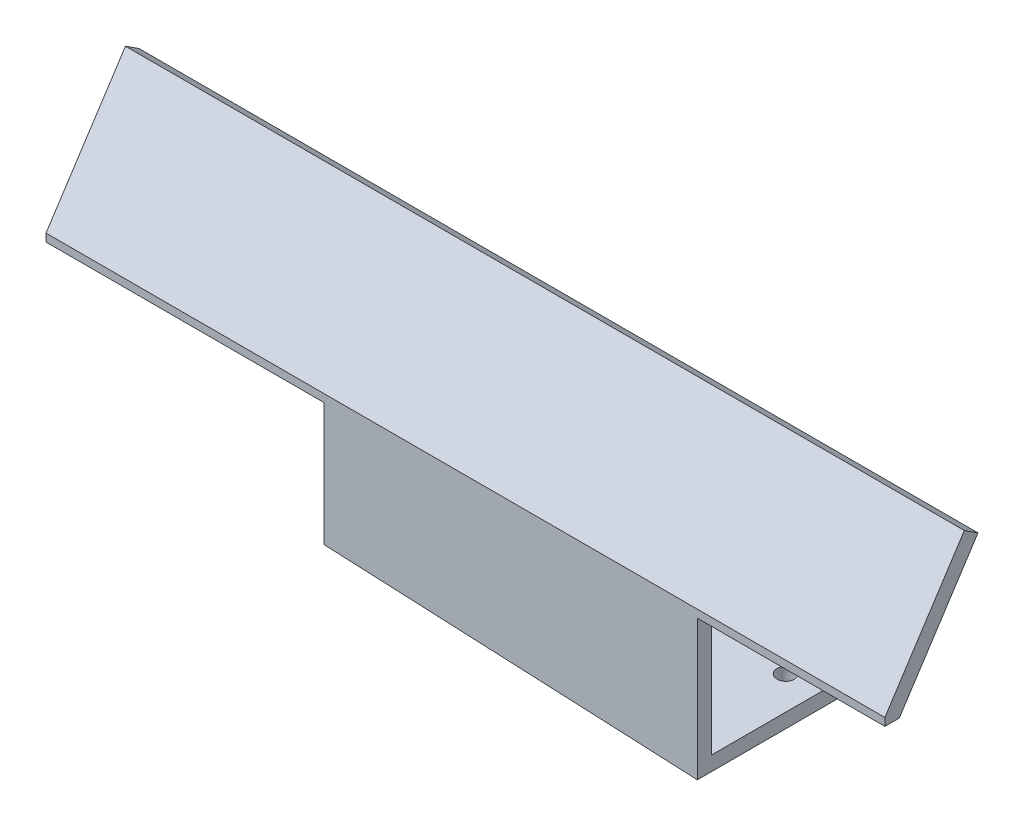
ISO-10303-21;
HEADER;
FILE_DESCRIPTION(('STEP AP214'),'2;1');
FILE_NAME('part.step','',(''),(''),'','','');
FILE_SCHEMA(('AUTOMOTIVE_DESIGN { 1 0 10303 214 1 1 1 1 }'));
ENDSEC;
DATA;
#1=APPLICATION_CONTEXT('core data for automotive mechanical design processes');
#2=APPLICATION_PROTOCOL_DEFINITION('international standard','automotive_design',2000,#1);
#3=PRODUCT_CONTEXT('',#1,'mechanical');
#4=PRODUCT('Part','Part','',(#3));
#5=PRODUCT_RELATED_PRODUCT_CATEGORY('part','',(#4));
#6=PRODUCT_DEFINITION_FORMATION('','',#4);
#7=PRODUCT_DEFINITION_CONTEXT('part definition',#1,'design');
#8=PRODUCT_DEFINITION('design','',#6,#7);
#9=PRODUCT_DEFINITION_SHAPE('','',#8);
#10=(LENGTH_UNIT() NAMED_UNIT(*) SI_UNIT(.MILLI.,.METRE.));
#11=(NAMED_UNIT(*) PLANE_ANGLE_UNIT() SI_UNIT($,.RADIAN.));
#12=(NAMED_UNIT(*) SI_UNIT($,.STERADIAN.) SOLID_ANGLE_UNIT());
#13=UNCERTAINTY_MEASURE_WITH_UNIT(LENGTH_MEASURE(1.E-05),#10,'distance_accuracy_value','');
#14=(GEOMETRIC_REPRESENTATION_CONTEXT(3) GLOBAL_UNCERTAINTY_ASSIGNED_CONTEXT((#13)) GLOBAL_UNIT_ASSIGNED_CONTEXT((#10,
#11,#12)) REPRESENTATION_CONTEXT('',''));
#15=CARTESIAN_POINT('',(0.,0.,0.));
#16=DIRECTION('',(0.,0.,1.));
#17=DIRECTION('',(1.,0.,0.));
#18=AXIS2_PLACEMENT_3D('',#15,#16,#17);
#19=CARTESIAN_POINT('',(0.,-27.8330856524257,8.58819121069135));
#20=DIRECTION('',(-0.0456665936873856,-0.99895673691156,0.));
#21=DIRECTION('',(0.99895673691156,-0.0456665936873856,0.));
#22=AXIS2_PLACEMENT_3D('',#19,#20,#21);
#23=PLANE('',#22);
#24=DIRECTION('',(0.,0.,-1.));
#25=VECTOR('',#24,1.);
#26=CARTESIAN_POINT('',(135.876250770617,-34.0445714019396,8.58819121069135));
#27=LINE('',#26,#25);
#28=CARTESIAN_POINT('',(135.876250770617,-34.0445714019396,8.58819121069136));
#29=VERTEX_POINT('',#28);
#30=CARTESIAN_POINT('',(135.876250770617,-34.0445714019396,-21.4118087893087));
#31=VERTEX_POINT('',#30);
#32=EDGE_CURVE('E172',#29,#31,#27,.T.);
#33=ORIENTED_EDGE('',*,*,#32,.F.);
#34=DIRECTION('',(-0.99895673691156,0.0456665936873856,0.));
#35=VECTOR('',#34,1.);
#36=CARTESIAN_POINT('',(0.,-27.8330856524257,8.58819121069135));
#37=LINE('',#36,#35);
#38=CARTESIAN_POINT('',(57.9999999999998,-30.4845142238542,8.58819121069136));
#39=VERTEX_POINT('',#38);
#40=EDGE_CURVE('E159',#29,#39,#37,.T.);
#41=ORIENTED_EDGE('',*,*,#40,.T.);
#42=DIRECTION('',(0.,0.,1.));
#43=VECTOR('',#42,1.);
#44=CARTESIAN_POINT('',(57.9999999999998,-30.4845142238542,8.58819121069135));
#45=LINE('',#44,#43);
#46=CARTESIAN_POINT('',(57.9999999999998,-30.4845142238542,-21.4118087893087));
#47=VERTEX_POINT('',#46);
#48=EDGE_CURVE('E210',#47,#39,#45,.T.);
#49=ORIENTED_EDGE('',*,*,#48,.F.);
#50=DIRECTION('',(0.99895673691156,-0.0456665936873856,0.));
#51=VECTOR('',#50,1.);
#52=CARTESIAN_POINT('',(0.,-27.8330856524257,-21.4118087893087));
#53=LINE('',#52,#51);
#54=EDGE_CURVE('E220',#47,#31,#53,.T.);
#55=ORIENTED_EDGE('',*,*,#54,.T.);
#56=EDGE_LOOP('',(#33,#41,#49,#55));
#57=FACE_BOUND('',#56,.T.);
#58=CARTESIAN_POINT('',(129.113000218938,-33.7353942338628,-16.4118087893087));
#59=DIRECTION('',(-0.0456665936873856,-0.99895673691156,0.));
#60=DIRECTION('',(0.99895673691156,-0.0456665936873856,0.));
#61=AXIS2_PLACEMENT_3D('',#58,#59,#60);
#62=CIRCLE('',#61,1.8);
#63=CARTESIAN_POINT('',(130.911122345379,-33.8175941025001,-16.4118087893087));
#64=VERTEX_POINT('',#63);
#65=EDGE_CURVE('E180',#64,#64,#62,.F.);
#66=ORIENTED_EDGE('',*,*,#65,.T.);
#67=EDGE_LOOP('',(#66));
#68=FACE_BOUND('',#67,.T.);
#69=CARTESIAN_POINT('',(81.6130002189377,-31.5639656624343,-16.4118087893087));
#70=DIRECTION('',(-0.0456665936873856,-0.99895673691156,0.));
#71=DIRECTION('',(0.99895673691156,-0.0456665936873856,0.));
#72=AXIS2_PLACEMENT_3D('',#69,#70,#71);
#73=CIRCLE('',#72,1.79999999999999);
#74=CARTESIAN_POINT('',(83.4111223453785,-31.6461655310715,-16.4118087893087));
#75=VERTEX_POINT('',#74);
#76=EDGE_CURVE('E187',#75,#75,#73,.T.);
#77=ORIENTED_EDGE('',*,*,#76,.F.);
#78=EDGE_LOOP('',(#77));
#79=FACE_BOUND('',#78,.T.);
#80=ADVANCED_FACE('F42',(#57,#68,#79),#23,.T.);
#81=CARTESIAN_POINT('',(-1.13271640106812,-24.778171273365,0.));
#82=DIRECTION('',(-0.0456665936873856,-0.99895673691156,0.));
#83=DIRECTION('',(0.99895673691156,-0.0456665936873856,0.));
#84=AXIS2_PLACEMENT_3D('',#81,#82,#83);
#85=PLANE('',#84);
#86=DIRECTION('',(0.99895673691156,-0.0456665936873856,0.));
#87=VECTOR('',#86,1.);
#88=CARTESIAN_POINT('',(174.492701335583,-32.8067617984691,5.58819121069135));
#89=LINE('',#88,#87);
#90=CARTESIAN_POINT('',(57.9999999999998,-27.4813811659853,5.58819121069135));
#91=VERTEX_POINT('',#90);
#92=CARTESIAN_POINT('',(135.876250770617,-31.0414383440707,5.58819121069135));
#93=VERTEX_POINT('',#92);
#94=EDGE_CURVE('E225',#91,#93,#89,.T.);
#95=ORIENTED_EDGE('',*,*,#94,.T.);
#96=DIRECTION('',(0.,0.,-1.));
#97=VECTOR('',#96,1.);
#98=CARTESIAN_POINT('',(135.876250770617,-31.0414383440706,0.));
#99=LINE('',#98,#97);
#100=CARTESIAN_POINT('',(135.876250770617,-31.0414383440707,-21.4118087893087));
#101=VERTEX_POINT('',#100);
#102=EDGE_CURVE('E168',#93,#101,#99,.T.);
#103=ORIENTED_EDGE('',*,*,#102,.T.);
#104=DIRECTION('',(0.99895673691156,-0.0456665936873856,0.));
#105=VECTOR('',#104,1.);
#106=CARTESIAN_POINT('',(0.136999781062157,-24.836215441691,-21.4118087893087));
#107=LINE('',#106,#105);
#108=CARTESIAN_POINT('',(57.9999999999998,-27.4813811659853,-21.4118087893087));
#109=VERTEX_POINT('',#108);
#110=EDGE_CURVE('E221',#109,#101,#107,.T.);
#111=ORIENTED_EDGE('',*,*,#110,.F.);
#112=DIRECTION('',(0.,0.,1.));
#113=VECTOR('',#112,1.);
#114=CARTESIAN_POINT('',(57.9999999999998,-27.4813811659853,0.));
#115=LINE('',#114,#113);
#116=EDGE_CURVE('E57',#109,#91,#115,.T.);
#117=ORIENTED_EDGE('',*,*,#116,.T.);
#118=EDGE_LOOP('',(#95,#103,#111,#117));
#119=FACE_BOUND('',#118,.T.);
#120=CARTESIAN_POINT('',(129.25,-30.7385240231282,-16.4118087893087));
#121=DIRECTION('',(-0.0456665936873856,-0.99895673691156,0.));
#122=DIRECTION('',(0.99895673691156,-0.0456665936873856,0.));
#123=AXIS2_PLACEMENT_3D('',#120,#121,#122);
#124=CIRCLE('',#123,1.8);
#125=CARTESIAN_POINT('',(131.048122126441,-30.8207238917655,-16.4118087893087));
#126=VERTEX_POINT('',#125);
#127=EDGE_CURVE('E175',#126,#126,#124,.T.);
#128=ORIENTED_EDGE('',*,*,#127,.T.);
#129=EDGE_LOOP('',(#128));
#130=FACE_BOUND('',#129,.T.);
#131=CARTESIAN_POINT('',(81.7499999999999,-28.5670954516996,-16.4118087893087));
#132=DIRECTION('',(0.0456665936873856,0.99895673691156,0.));
#133=DIRECTION('',(-0.99895673691156,0.0456665936873856,0.));
#134=AXIS2_PLACEMENT_3D('',#131,#132,#133);
#135=CIRCLE('',#134,1.79999999999999);
#136=CARTESIAN_POINT('',(79.9518778735591,-28.4848955830623,-16.4118087893087));
#137=VERTEX_POINT('',#136);
#138=EDGE_CURVE('E176',#137,#137,#135,.T.);
#139=ORIENTED_EDGE('',*,*,#138,.F.);
#140=EDGE_LOOP('',(#139));
#141=FACE_BOUND('',#140,.T.);
#142=ADVANCED_FACE('F280',(#119,#130,#141),#85,.F.);
#143=CARTESIAN_POINT('',(175.,-21.7096035143508,5.58819121069135));
#144=DIRECTION('',(0.,0.,1.));
#145=DIRECTION('',(0.,-1.,0.));
#146=AXIS2_PLACEMENT_3D('',#143,#144,#145);
#147=PLANE('',#146);
#148=DIRECTION('',(-1.,0.,0.));
#149=VECTOR('',#148,1.);
#150=CARTESIAN_POINT('',(175.,-4.83308565242567,5.58819121069135));
#151=LINE('',#150,#149);
#152=CARTESIAN_POINT('',(135.876250770617,-4.83308565242567,5.58819121069135));
#153=VERTEX_POINT('',#152);
#154=CARTESIAN_POINT('',(57.9999999999998,-4.83308565242567,5.58819121069135));
#155=VERTEX_POINT('',#154);
#156=EDGE_CURVE('E265',#153,#155,#151,.T.);
#157=ORIENTED_EDGE('',*,*,#156,.F.);
#158=DIRECTION('',(0.,-1.,0.));
#159=VECTOR('',#158,1.);
#160=CARTESIAN_POINT('',(135.876250770617,-21.7096035143508,5.58819121069135));
#161=LINE('',#160,#159);
#162=EDGE_CURVE('E153',#153,#93,#161,.T.);
#163=ORIENTED_EDGE('',*,*,#162,.T.);
#164=ORIENTED_EDGE('',*,*,#94,.F.);
#165=DIRECTION('',(0.,1.,0.));
#166=VECTOR('',#165,1.);
#167=CARTESIAN_POINT('',(57.9999999999998,-21.7096035143508,5.58819121069135));
#168=LINE('',#167,#166);
#169=EDGE_CURVE('E206',#91,#155,#168,.T.);
#170=ORIENTED_EDGE('',*,*,#169,.T.);
#171=EDGE_LOOP('',(#157,#163,#164,#170));
#172=FACE_BOUND('',#171,.T.);
#173=ADVANCED_FACE('F44',(#172),#147,.F.);
#174=CARTESIAN_POINT('',(175.,-21.7096035143508,8.58819121069135));
#175=DIRECTION('',(0.,0.,-1.));
#176=DIRECTION('',(-1.,0.,0.));
#177=AXIS2_PLACEMENT_3D('',#174,#175,#176);
#178=PLANE('',#177);
#179=DIRECTION('',(0.,1.,0.));
#180=VECTOR('',#179,1.);
#181=CARTESIAN_POINT('',(135.876250770617,-4.83308565242567,8.58819121069136));
#182=LINE('',#181,#180);
#183=CARTESIAN_POINT('',(135.876250770617,-4.83308565242567,8.58819121069136));
#184=VERTEX_POINT('',#183);
#185=EDGE_CURVE('E150',#29,#184,#182,.T.);
#186=ORIENTED_EDGE('',*,*,#185,.T.);
#187=DIRECTION('',(1.,0.,0.));
#188=VECTOR('',#187,1.);
#189=CARTESIAN_POINT('',(0.,-4.83308565242567,8.58819121069135));
#190=LINE('',#189,#188);
#191=CARTESIAN_POINT('',(175.,-4.83308565242567,8.58819121069135));
#192=VERTEX_POINT('',#191);
#193=EDGE_CURVE('E135',#184,#192,#190,.T.);
#194=ORIENTED_EDGE('',*,*,#193,.T.);
#195=DIRECTION('',(0.,-1.,0.));
#196=VECTOR('',#195,1.);
#197=CARTESIAN_POINT('',(175.,-21.7096035143508,8.58819121069135));
#198=LINE('',#197,#196);
#199=CARTESIAN_POINT('',(175.,-3.20960351435076,8.58819121069135));
#200=VERTEX_POINT('',#199);
#201=EDGE_CURVE('E243',#200,#192,#198,.T.);
#202=ORIENTED_EDGE('',*,*,#201,.F.);
#203=DIRECTION('',(-1.,0.,0.));
#204=VECTOR('',#203,1.);
#205=CARTESIAN_POINT('',(175.,-3.20960351435076,8.58819121069135));
#206=LINE('',#205,#204);
#207=CARTESIAN_POINT('',(0.,-3.20960351435076,8.58819121069135));
#208=VERTEX_POINT('',#207);
#209=EDGE_CURVE('E246',#200,#208,#206,.T.);
#210=ORIENTED_EDGE('',*,*,#209,.T.);
#211=DIRECTION('',(0.,-1.,0.));
#212=VECTOR('',#211,1.);
#213=CARTESIAN_POINT('',(0.,-21.7096035143508,8.58819121069135));
#214=LINE('',#213,#212);
#215=CARTESIAN_POINT('',(0.,-4.83308565242567,8.58819121069135));
#216=VERTEX_POINT('',#215);
#217=EDGE_CURVE('E238',#208,#216,#214,.T.);
#218=ORIENTED_EDGE('',*,*,#217,.T.);
#219=DIRECTION('',(1.,0.,0.));
#220=VECTOR('',#219,1.);
#221=CARTESIAN_POINT('',(0.,-4.83308565242567,8.58819121069135));
#222=LINE('',#221,#220);
#223=CARTESIAN_POINT('',(57.9999999999998,-4.83308565242567,8.58819121069135));
#224=VERTEX_POINT('',#223);
#225=EDGE_CURVE('E190',#216,#224,#222,.T.);
#226=ORIENTED_EDGE('',*,*,#225,.T.);
#227=DIRECTION('',(0.,-1.,0.));
#228=VECTOR('',#227,1.);
#229=CARTESIAN_POINT('',(57.9999999999998,0.,8.58819121069135));
#230=LINE('',#229,#228);
#231=EDGE_CURVE('E195',#224,#39,#230,.T.);
#232=ORIENTED_EDGE('',*,*,#231,.T.);
#233=ORIENTED_EDGE('',*,*,#40,.F.);
#234=EDGE_LOOP('',(#186,#194,#202,#210,#218,#226,#232,#233));
#235=FACE_BOUND('',#234,.T.);
#236=ADVANCED_FACE('F157',(#235),#178,.F.);
#237=CARTESIAN_POINT('',(0.136999781062157,-24.836215441691,-21.4118087893087));
#238=DIRECTION('',(0.,0.,-1.));
#239=DIRECTION('',(0.,1.,0.));
#240=AXIS2_PLACEMENT_3D('',#237,#238,#239);
#241=PLANE('',#240);
#242=DIRECTION('',(0.,1.,0.));
#243=VECTOR('',#242,1.);
#244=CARTESIAN_POINT('',(135.876250770617,-4.83308565242567,-21.4118087893087));
#245=LINE('',#244,#243);
#246=EDGE_CURVE('E161',#31,#101,#245,.T.);
#247=ORIENTED_EDGE('',*,*,#246,.F.);
#248=ORIENTED_EDGE('',*,*,#54,.F.);
#249=DIRECTION('',(0.,-1.,0.));
#250=VECTOR('',#249,1.);
#251=CARTESIAN_POINT('',(57.9999999999998,-24.836215441691,-21.4118087893087));
#252=LINE('',#251,#250);
#253=EDGE_CURVE('E11',#109,#47,#252,.T.);
#254=ORIENTED_EDGE('',*,*,#253,.F.);
#255=ORIENTED_EDGE('',*,*,#110,.T.);
#256=EDGE_LOOP('',(#247,#248,#254,#255));
#257=FACE_BOUND('',#256,.T.);
#258=ADVANCED_FACE('F285',(#257),#241,.T.);
#259=CARTESIAN_POINT('',(175.,0.,0.));
#260=DIRECTION('',(1.,0.,0.));
#261=DIRECTION('',(0.,0.,-1.));
#262=AXIS2_PLACEMENT_3D('',#259,#260,#261);
#263=PLANE('',#262);
#264=DIRECTION('',(0.,0.,1.));
#265=VECTOR('',#264,1.);
#266=CARTESIAN_POINT('',(175.,-4.83308565242567,0.));
#267=LINE('',#266,#265);
#268=CARTESIAN_POINT('',(175.,-4.83308565242567,5.58819121069135));
#269=VERTEX_POINT('',#268);
#270=EDGE_CURVE('E140',#269,#192,#267,.T.);
#271=ORIENTED_EDGE('',*,*,#270,.F.);
#272=DIRECTION('',(0.,0.83822570686827,-0.545323449289675));
#273=VECTOR('',#272,1.);
#274=CARTESIAN_POINT('',(175.,20.4183582468598,-10.8396090510669));
#275=LINE('',#274,#273);
#276=CARTESIAN_POINT('',(175.,20.4183582468598,-10.8396090510669));
#277=VERTEX_POINT('',#276);
#278=EDGE_CURVE('E88',#269,#277,#275,.T.);
#279=ORIENTED_EDGE('',*,*,#278,.T.);
#280=DIRECTION('',(0.,0.545323449289676,0.83822570686827));
#281=VECTOR('',#280,1.);
#282=CARTESIAN_POINT('',(175.,22.2724579744447,-7.98964164771477));
#283=LINE('',#282,#281);
#284=CARTESIAN_POINT('',(175.,22.2724579744447,-7.98964164771477));
#285=VERTEX_POINT('',#284);
#286=EDGE_CURVE('E237',#277,#285,#283,.T.);
#287=ORIENTED_EDGE('',*,*,#286,.T.);
#288=DIRECTION('',(0.,-0.83822570686827,0.545323449289675));
#289=VECTOR('',#288,1.);
#290=CARTESIAN_POINT('',(175.,-3.20960351435076,8.58819121069135));
#291=LINE('',#290,#289);
#292=EDGE_CURVE('E66',#285,#200,#291,.T.);
#293=ORIENTED_EDGE('',*,*,#292,.T.);
#294=ORIENTED_EDGE('',*,*,#201,.T.);
#295=EDGE_LOOP('',(#271,#279,#287,#293,#294));
#296=FACE_BOUND('',#295,.T.);
#297=ADVANCED_FACE('F312',(#296),#263,.T.);
#298=CARTESIAN_POINT('',(175.,20.4183582468598,-10.8396090510669));
#299=DIRECTION('',(0.,0.545323449289675,0.83822570686827));
#300=DIRECTION('',(0.,-0.83822570686827,0.545323449289675));
#301=AXIS2_PLACEMENT_3D('',#298,#299,#300);
#302=PLANE('',#301);
#303=DIRECTION('',(0.,0.83822570686827,-0.545323449289675));
#304=VECTOR('',#303,1.);
#305=CARTESIAN_POINT('',(0.,20.4183582468598,-10.8396090510669));
#306=LINE('',#305,#304);
#307=CARTESIAN_POINT('',(0.,-4.83308565242567,5.58819121069135));
#308=VERTEX_POINT('',#307);
#309=CARTESIAN_POINT('',(0.,20.4183582468598,-10.8396090510669));
#310=VERTEX_POINT('',#309);
#311=EDGE_CURVE('E234',#308,#310,#306,.T.);
#312=ORIENTED_EDGE('',*,*,#311,.T.);
#313=DIRECTION('',(-1.,0.,0.));
#314=VECTOR('',#313,1.);
#315=CARTESIAN_POINT('',(175.,20.4183582468598,-10.8396090510669));
#316=LINE('',#315,#314);
#317=EDGE_CURVE('E262',#277,#310,#316,.T.);
#318=ORIENTED_EDGE('',*,*,#317,.F.);
#319=ORIENTED_EDGE('',*,*,#278,.F.);
#320=EDGE_CURVE('E51',#269,#153,#151,.T.);
#321=ORIENTED_EDGE('',*,*,#320,.T.);
#322=ORIENTED_EDGE('',*,*,#156,.T.);
#323=DIRECTION('',(-1.,0.,0.));
#324=VECTOR('',#323,1.);
#325=CARTESIAN_POINT('',(175.,-4.83308565242567,5.58819121069135));
#326=LINE('',#325,#324);
#327=EDGE_CURVE('E214',#155,#308,#326,.T.);
#328=ORIENTED_EDGE('',*,*,#327,.T.);
#329=EDGE_LOOP('',(#312,#318,#319,#321,#322,#328));
#330=FACE_BOUND('',#329,.T.);
#331=ADVANCED_FACE('F270',(#330),#302,.F.);
#332=CARTESIAN_POINT('',(175.,22.2724579744447,-7.98964164771477));
#333=DIRECTION('',(0.,-0.83822570686827,0.545323449289676));
#334=DIRECTION('',(0.,-0.545323449289676,-0.83822570686827));
#335=AXIS2_PLACEMENT_3D('',#332,#333,#334);
#336=PLANE('',#335);
#337=DIRECTION('',(0.,0.545323449289676,0.83822570686827));
#338=VECTOR('',#337,1.);
#339=CARTESIAN_POINT('',(0.,22.2724579744447,-7.98964164771477));
#340=LINE('',#339,#338);
#341=CARTESIAN_POINT('',(0.,22.2724579744447,-7.98964164771477));
#342=VERTEX_POINT('',#341);
#343=EDGE_CURVE('E249',#310,#342,#340,.T.);
#344=ORIENTED_EDGE('',*,*,#343,.T.);
#345=DIRECTION('',(-1.,0.,0.));
#346=VECTOR('',#345,1.);
#347=CARTESIAN_POINT('',(175.,22.2724579744447,-7.98964164771477));
#348=LINE('',#347,#346);
#349=EDGE_CURVE('E259',#285,#342,#348,.T.);
#350=ORIENTED_EDGE('',*,*,#349,.F.);
#351=ORIENTED_EDGE('',*,*,#286,.F.);
#352=ORIENTED_EDGE('',*,*,#317,.T.);
#353=EDGE_LOOP('',(#344,#350,#351,#352));
#354=FACE_BOUND('',#353,.T.);
#355=ADVANCED_FACE('F325',(#354),#336,.F.);
#356=CARTESIAN_POINT('',(175.,-3.20960351435076,8.58819121069135));
#357=DIRECTION('',(0.,-0.545323449289675,-0.83822570686827));
#358=DIRECTION('',(0.,0.83822570686827,-0.545323449289675));
#359=AXIS2_PLACEMENT_3D('',#356,#357,#358);
#360=PLANE('',#359);
#361=DIRECTION('',(0.,-0.83822570686827,0.545323449289675));
#362=VECTOR('',#361,1.);
#363=CARTESIAN_POINT('',(0.,-3.20960351435076,8.58819121069135));
#364=LINE('',#363,#362);
#365=EDGE_CURVE('E83',#342,#208,#364,.T.);
#366=ORIENTED_EDGE('',*,*,#365,.T.);
#367=ORIENTED_EDGE('',*,*,#209,.F.);
#368=ORIENTED_EDGE('',*,*,#292,.F.);
#369=ORIENTED_EDGE('',*,*,#349,.T.);
#370=EDGE_LOOP('',(#366,#367,#368,#369));
#371=FACE_BOUND('',#370,.T.);
#372=ADVANCED_FACE('F319',(#371),#360,.F.);
#373=CARTESIAN_POINT('',(0.,0.,0.));
#374=DIRECTION('',(1.,0.,0.));
#375=DIRECTION('',(0.,0.,-1.));
#376=AXIS2_PLACEMENT_3D('',#373,#374,#375);
#377=PLANE('',#376);
#378=ORIENTED_EDGE('',*,*,#311,.F.);
#379=DIRECTION('',(0.,0.,-1.));
#380=VECTOR('',#379,1.);
#381=CARTESIAN_POINT('',(0.,-4.83308565242567,8.58819121069135));
#382=LINE('',#381,#380);
#383=EDGE_CURVE('E145',#216,#308,#382,.T.);
#384=ORIENTED_EDGE('',*,*,#383,.F.);
#385=ORIENTED_EDGE('',*,*,#217,.F.);
#386=ORIENTED_EDGE('',*,*,#365,.F.);
#387=ORIENTED_EDGE('',*,*,#343,.F.);
#388=EDGE_LOOP('',(#378,#384,#385,#386,#387));
#389=FACE_BOUND('',#388,.T.);
#390=ADVANCED_FACE('F316',(#389),#377,.F.);
#391=CARTESIAN_POINT('',(0.,-4.83308565242567,8.58819121069135));
#392=DIRECTION('',(0.,1.,0.));
#393=DIRECTION('',(0.,0.,1.));
#394=AXIS2_PLACEMENT_3D('',#391,#392,#393);
#395=PLANE('',#394);
#396=DIRECTION('',(0.,0.,-1.));
#397=VECTOR('',#396,1.);
#398=CARTESIAN_POINT('',(57.9999999999998,-4.83308565242567,8.58819121069135));
#399=LINE('',#398,#397);
#400=EDGE_CURVE('E198',#224,#155,#399,.T.);
#401=ORIENTED_EDGE('',*,*,#400,.F.);
#402=ORIENTED_EDGE('',*,*,#225,.F.);
#403=ORIENTED_EDGE('',*,*,#383,.T.);
#404=ORIENTED_EDGE('',*,*,#327,.F.);
#405=EDGE_LOOP('',(#401,#402,#403,#404));
#406=FACE_BOUND('',#405,.T.);
#407=ADVANCED_FACE('F274',(#406),#395,.F.);
#408=CARTESIAN_POINT('',(57.9999999999998,0.,8.58819121069135));
#409=DIRECTION('',(1.,0.,0.));
#410=DIRECTION('',(0.,0.,-1.));
#411=AXIS2_PLACEMENT_3D('',#408,#409,#410);
#412=PLANE('',#411);
#413=ORIENTED_EDGE('',*,*,#48,.T.);
#414=ORIENTED_EDGE('',*,*,#231,.F.);
#415=ORIENTED_EDGE('',*,*,#400,.T.);
#416=ORIENTED_EDGE('',*,*,#169,.F.);
#417=ORIENTED_EDGE('',*,*,#116,.F.);
#418=ORIENTED_EDGE('',*,*,#253,.T.);
#419=EDGE_LOOP('',(#413,#414,#415,#416,#417,#418));
#420=FACE_BOUND('',#419,.T.);
#421=ADVANCED_FACE('F277',(#420),#412,.F.);
#422=CARTESIAN_POINT('',(0.,-4.83308565242567,8.58819121069135));
#423=DIRECTION('',(0.,1.,0.));
#424=DIRECTION('',(0.,0.,1.));
#425=AXIS2_PLACEMENT_3D('',#422,#423,#424);
#426=PLANE('',#425);
#427=ORIENTED_EDGE('',*,*,#270,.T.);
#428=ORIENTED_EDGE('',*,*,#193,.F.);
#429=DIRECTION('',(0.,0.,-1.));
#430=VECTOR('',#429,1.);
#431=CARTESIAN_POINT('',(135.876250770617,-4.83308565242567,8.58819121069136));
#432=LINE('',#431,#430);
#433=EDGE_CURVE('E138',#184,#153,#432,.T.);
#434=ORIENTED_EDGE('',*,*,#433,.T.);
#435=ORIENTED_EDGE('',*,*,#320,.F.);
#436=EDGE_LOOP('',(#427,#428,#434,#435));
#437=FACE_BOUND('',#436,.T.);
#438=ADVANCED_FACE('F137',(#437),#426,.F.);
#439=CARTESIAN_POINT('',(128.793928238749,-40.7150938004828,-16.4118087893087));
#440=DIRECTION('',(0.0456665936873856,0.99895673691156,0.));
#441=DIRECTION('',(-0.99895673691156,0.0456665936873856,0.));
#442=AXIS2_PLACEMENT_3D('',#439,#440,#441);
#443=CYLINDRICAL_SURFACE('',#442,1.8);
#444=ORIENTED_EDGE('',*,*,#65,.F.);
#445=EDGE_LOOP('',(#444));
#446=FACE_BOUND('',#445,.T.);
#447=ORIENTED_EDGE('',*,*,#127,.F.);
#448=EDGE_LOOP('',(#447));
#449=FACE_BOUND('',#448,.T.);
#450=ADVANCED_FACE('F299',(#446,#449),#443,.F.);
#451=CARTESIAN_POINT('',(81.2939282387494,-38.5436652290542,-16.4118087893087));
#452=DIRECTION('',(0.0456665936873856,0.99895673691156,0.));
#453=DIRECTION('',(-0.99895673691156,0.0456665936873856,0.));
#454=AXIS2_PLACEMENT_3D('',#451,#452,#453);
#455=CYLINDRICAL_SURFACE('',#454,1.79999999999999);
#456=ORIENTED_EDGE('',*,*,#76,.T.);
#457=EDGE_LOOP('',(#456));
#458=FACE_BOUND('',#457,.T.);
#459=ORIENTED_EDGE('',*,*,#138,.T.);
#460=EDGE_LOOP('',(#459));
#461=FACE_BOUND('',#460,.T.);
#462=ADVANCED_FACE('F296',(#458,#461),#455,.F.);
#463=CARTESIAN_POINT('',(135.876250770617,-4.83308565242567,8.58819121069136));
#464=DIRECTION('',(-1.,0.,0.));
#465=DIRECTION('',(0.,0.,1.));
#466=AXIS2_PLACEMENT_3D('',#463,#464,#465);
#467=PLANE('',#466);
#468=ORIENTED_EDGE('',*,*,#32,.T.);
#469=ORIENTED_EDGE('',*,*,#246,.T.);
#470=ORIENTED_EDGE('',*,*,#102,.F.);
#471=ORIENTED_EDGE('',*,*,#162,.F.);
#472=ORIENTED_EDGE('',*,*,#433,.F.);
#473=ORIENTED_EDGE('',*,*,#185,.F.);
#474=EDGE_LOOP('',(#468,#469,#470,#471,#472,#473));
#475=FACE_BOUND('',#474,.T.);
#476=ADVANCED_FACE('F149',(#475),#467,.F.);
#477=CLOSED_SHELL('',(#80,#142,#173,#236,#258,#297,#331,#355,#372,#390,#407,#421,#438,#450,#462,#476));
#478=MANIFOLD_SOLID_BREP('B2',#477);
#479=ADVANCED_BREP_SHAPE_REPRESENTATION('',(#18,#478),#14);
#480=SHAPE_DEFINITION_REPRESENTATION(#9,#479);
ENDSEC;
END-ISO-10303-21;
